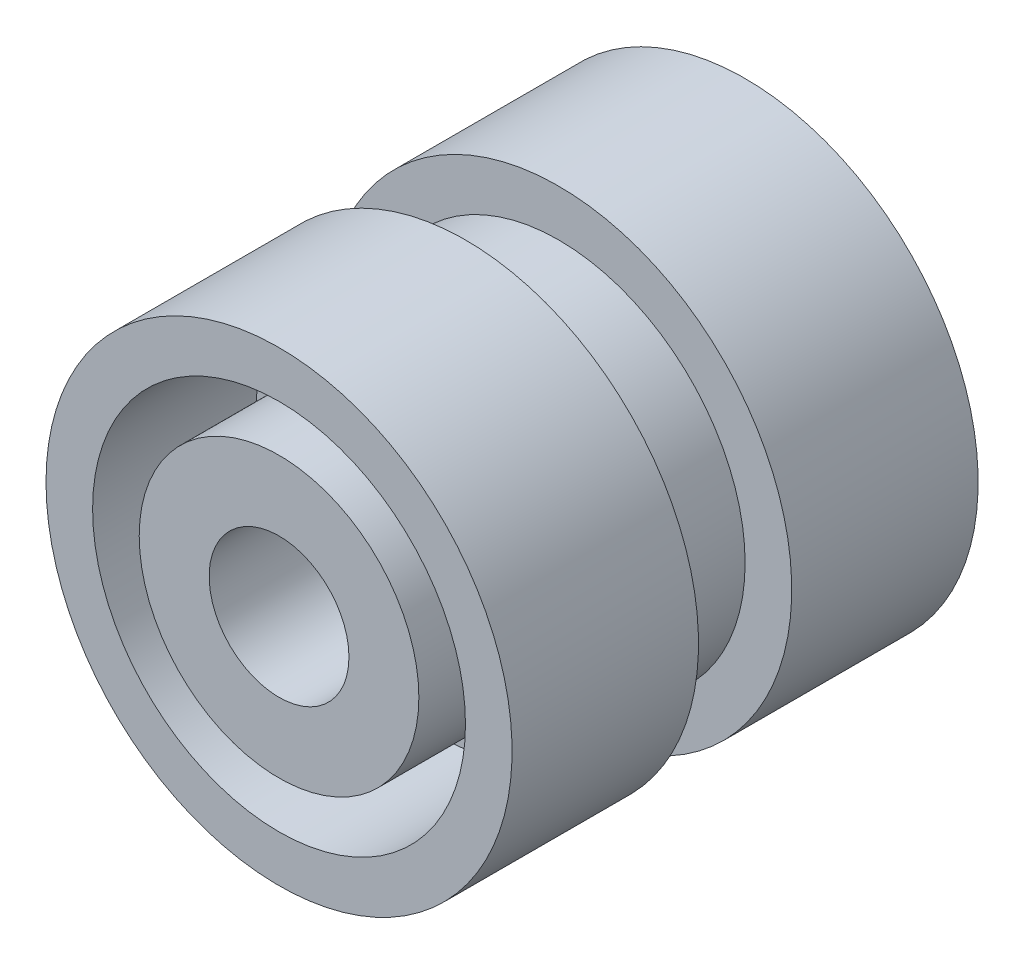
ISO-10303-21;
HEADER;
FILE_DESCRIPTION(('STEP AP214'),'2;1');
FILE_NAME('part.step','',(''),(''),'','','');
FILE_SCHEMA(('AUTOMOTIVE_DESIGN { 1 0 10303 214 1 1 1 1 }'));
ENDSEC;
DATA;
#1=APPLICATION_CONTEXT('core data for automotive mechanical design processes');
#2=APPLICATION_PROTOCOL_DEFINITION('international standard','automotive_design',2000,#1);
#3=PRODUCT_CONTEXT('',#1,'mechanical');
#4=PRODUCT('Part','Part','',(#3));
#5=PRODUCT_RELATED_PRODUCT_CATEGORY('part','',(#4));
#6=PRODUCT_DEFINITION_FORMATION('','',#4);
#7=PRODUCT_DEFINITION_CONTEXT('part definition',#1,'design');
#8=PRODUCT_DEFINITION('design','',#6,#7);
#9=PRODUCT_DEFINITION_SHAPE('','',#8);
#10=(LENGTH_UNIT() NAMED_UNIT(*) SI_UNIT(.MILLI.,.METRE.));
#11=(NAMED_UNIT(*) PLANE_ANGLE_UNIT() SI_UNIT($,.RADIAN.));
#12=(NAMED_UNIT(*) SI_UNIT($,.STERADIAN.) SOLID_ANGLE_UNIT());
#13=UNCERTAINTY_MEASURE_WITH_UNIT(LENGTH_MEASURE(1.E-05),#10,'distance_accuracy_value','');
#14=(GEOMETRIC_REPRESENTATION_CONTEXT(3) GLOBAL_UNCERTAINTY_ASSIGNED_CONTEXT((#13)) GLOBAL_UNIT_ASSIGNED_CONTEXT((#10,
#11,#12)) REPRESENTATION_CONTEXT('',''));
#15=CARTESIAN_POINT('',(0.,0.,0.));
#16=DIRECTION('',(0.,0.,1.));
#17=DIRECTION('',(1.,0.,0.));
#18=AXIS2_PLACEMENT_3D('',#15,#16,#17);
#19=CARTESIAN_POINT('',(0.,4.,-1.5));
#20=DIRECTION('',(0.,0.,-1.));
#21=DIRECTION('',(-1.,0.,0.));
#22=AXIS2_PLACEMENT_3D('',#19,#20,#21);
#23=PLANE('',#22);
#24=DIRECTION('',(0.,-1.,0.));
#25=VECTOR('',#24,1.);
#26=CARTESIAN_POINT('',(-0.5,0.,-1.5));
#27=LINE('',#26,#25);
#28=CARTESIAN_POINT('',(-0.5,-1.93649167310371,-1.5));
#29=VERTEX_POINT('',#28);
#30=CARTESIAN_POINT('',(-0.500000000000001,-3.96862696659689,-1.5));
#31=VERTEX_POINT('',#30);
#32=EDGE_CURVE('E159',#29,#31,#27,.T.);
#33=ORIENTED_EDGE('',*,*,#32,.T.);
#34=CARTESIAN_POINT('',(0.,0.,-1.5));
#35=DIRECTION('',(0.,0.,-1.));
#36=DIRECTION('',(-1.,0.,0.));
#37=AXIS2_PLACEMENT_3D('',#34,#35,#36);
#38=CIRCLE('',#37,4.);
#39=CARTESIAN_POINT('',(-3.96862696659689,-0.5,-1.5));
#40=VERTEX_POINT('',#39);
#41=EDGE_CURVE('E161',#31,#40,#38,.T.);
#42=ORIENTED_EDGE('',*,*,#41,.T.);
#43=DIRECTION('',(-1.,0.,0.));
#44=VECTOR('',#43,1.);
#45=CARTESIAN_POINT('',(0.,-0.5,-1.5));
#46=LINE('',#45,#44);
#47=CARTESIAN_POINT('',(-1.93649167310371,-0.5,-1.5));
#48=VERTEX_POINT('',#47);
#49=EDGE_CURVE('E61',#48,#40,#46,.T.);
#50=ORIENTED_EDGE('',*,*,#49,.F.);
#51=CARTESIAN_POINT('',(0.,0.,-1.5));
#52=DIRECTION('',(0.,0.,-1.));
#53=DIRECTION('',(-1.,0.,0.));
#54=AXIS2_PLACEMENT_3D('',#51,#52,#53);
#55=CIRCLE('',#54,2.);
#56=EDGE_CURVE('E56',#29,#48,#55,.T.);
#57=ORIENTED_EDGE('',*,*,#56,.F.);
#58=EDGE_LOOP('',(#33,#42,#50,#57));
#59=FACE_BOUND('',#58,.T.);
#60=ADVANCED_FACE('F41',(#59),#23,.T.);
#61=DIRECTION('',(-1.,0.,0.));
#62=VECTOR('',#61,1.);
#63=CARTESIAN_POINT('',(0.,0.5,-1.5));
#64=LINE('',#63,#62);
#65=CARTESIAN_POINT('',(-1.93649167310371,0.5,-1.5));
#66=VERTEX_POINT('',#65);
#67=CARTESIAN_POINT('',(-3.96862696659689,0.5,-1.5));
#68=VERTEX_POINT('',#67);
#69=EDGE_CURVE('E219',#66,#68,#64,.T.);
#70=ORIENTED_EDGE('',*,*,#69,.T.);
#71=CARTESIAN_POINT('',(-0.5,3.96862696659689,-1.5));
#72=VERTEX_POINT('',#71);
#73=EDGE_CURVE('E277',#68,#72,#38,.T.);
#74=ORIENTED_EDGE('',*,*,#73,.T.);
#75=DIRECTION('',(0.,1.,0.));
#76=VECTOR('',#75,1.);
#77=CARTESIAN_POINT('',(-0.5,0.,-1.5));
#78=LINE('',#77,#76);
#79=CARTESIAN_POINT('',(-0.5,1.93649167310371,-1.5));
#80=VERTEX_POINT('',#79);
#81=EDGE_CURVE('E224',#80,#72,#78,.T.);
#82=ORIENTED_EDGE('',*,*,#81,.F.);
#83=CARTESIAN_POINT('',(0.,0.,-1.5));
#84=DIRECTION('',(0.,0.,-1.));
#85=DIRECTION('',(-1.,0.,0.));
#86=AXIS2_PLACEMENT_3D('',#83,#84,#85);
#87=CIRCLE('',#86,2.);
#88=EDGE_CURVE('E221',#66,#80,#87,.T.);
#89=ORIENTED_EDGE('',*,*,#88,.F.);
#90=EDGE_LOOP('',(#70,#74,#82,#89));
#91=FACE_BOUND('',#90,.T.);
#92=ADVANCED_FACE('F326',(#91),#23,.T.);
#93=DIRECTION('',(0.,1.,0.));
#94=VECTOR('',#93,1.);
#95=CARTESIAN_POINT('',(0.5,0.,-1.5));
#96=LINE('',#95,#94);
#97=CARTESIAN_POINT('',(0.5,1.93649167310371,-1.5));
#98=VERTEX_POINT('',#97);
#99=CARTESIAN_POINT('',(0.5,3.96862696659689,-1.5));
#100=VERTEX_POINT('',#99);
#101=EDGE_CURVE('E227',#98,#100,#96,.T.);
#102=ORIENTED_EDGE('',*,*,#101,.T.);
#103=CARTESIAN_POINT('',(3.96862696659689,0.499999999999999,-1.5));
#104=VERTEX_POINT('',#103);
#105=EDGE_CURVE('E281',#100,#104,#38,.T.);
#106=ORIENTED_EDGE('',*,*,#105,.T.);
#107=DIRECTION('',(1.,0.,0.));
#108=VECTOR('',#107,1.);
#109=CARTESIAN_POINT('',(0.,0.5,-1.5));
#110=LINE('',#109,#108);
#111=CARTESIAN_POINT('',(1.93649167310371,0.5,-1.5));
#112=VERTEX_POINT('',#111);
#113=EDGE_CURVE('E232',#112,#104,#110,.T.);
#114=ORIENTED_EDGE('',*,*,#113,.F.);
#115=CARTESIAN_POINT('',(0.,0.,-1.5));
#116=DIRECTION('',(0.,0.,-1.));
#117=DIRECTION('',(-1.,0.,0.));
#118=AXIS2_PLACEMENT_3D('',#115,#116,#117);
#119=CIRCLE('',#118,2.);
#120=EDGE_CURVE('E229',#98,#112,#119,.T.);
#121=ORIENTED_EDGE('',*,*,#120,.F.);
#122=EDGE_LOOP('',(#102,#106,#114,#121));
#123=FACE_BOUND('',#122,.T.);
#124=ADVANCED_FACE('F330',(#123),#23,.T.);
#125=CARTESIAN_POINT('',(0.,0.,0.));
#126=DIRECTION('',(0.,0.,-1.));
#127=DIRECTION('',(-1.,0.,0.));
#128=AXIS2_PLACEMENT_3D('',#125,#126,#127);
#129=CYLINDRICAL_SURFACE('',#128,4.);
#130=CARTESIAN_POINT('',(0.,0.,-5.));
#131=DIRECTION('',(0.,0.,-1.));
#132=DIRECTION('',(-1.,0.,0.));
#133=AXIS2_PLACEMENT_3D('',#130,#131,#132);
#134=CIRCLE('',#133,4.);
#135=CARTESIAN_POINT('',(-4.,0.,-5.));
#136=VERTEX_POINT('',#135);
#137=EDGE_CURVE('E280',#136,#136,#134,.T.);
#138=ORIENTED_EDGE('',*,*,#137,.T.);
#139=EDGE_LOOP('',(#138));
#140=FACE_BOUND('',#139,.T.);
#141=CARTESIAN_POINT('',(0.,0.,-3.5));
#142=DIRECTION('',(0.,0.,-1.));
#143=DIRECTION('',(-1.,0.,0.));
#144=AXIS2_PLACEMENT_3D('',#141,#142,#143);
#145=CIRCLE('',#144,4.);
#146=CARTESIAN_POINT('',(-0.5,3.96862696659689,-3.5));
#147=VERTEX_POINT('',#146);
#148=CARTESIAN_POINT('',(0.5,3.96862696659689,-3.5));
#149=VERTEX_POINT('',#148);
#150=EDGE_CURVE('E191',#147,#149,#145,.T.);
#151=ORIENTED_EDGE('',*,*,#150,.F.);
#152=DIRECTION('',(0.,0.,1.));
#153=VECTOR('',#152,1.);
#154=CARTESIAN_POINT('',(-0.5,3.96862696659689,-3.5));
#155=LINE('',#154,#153);
#156=EDGE_CURVE('E263',#147,#72,#155,.T.);
#157=ORIENTED_EDGE('',*,*,#156,.T.);
#158=ORIENTED_EDGE('',*,*,#73,.F.);
#159=DIRECTION('',(0.,0.,1.));
#160=VECTOR('',#159,1.);
#161=CARTESIAN_POINT('',(-3.96862696659689,0.5,-3.5));
#162=LINE('',#161,#160);
#163=CARTESIAN_POINT('',(-3.96862696659689,0.5,-3.5));
#164=VERTEX_POINT('',#163);
#165=EDGE_CURVE('E271',#164,#68,#162,.T.);
#166=ORIENTED_EDGE('',*,*,#165,.F.);
#167=CARTESIAN_POINT('',(-3.96862696659689,-0.5,-3.5));
#168=VERTEX_POINT('',#167);
#169=EDGE_CURVE('E187',#168,#164,#145,.T.);
#170=ORIENTED_EDGE('',*,*,#169,.F.);
#171=DIRECTION('',(0.,0.,1.));
#172=VECTOR('',#171,1.);
#173=CARTESIAN_POINT('',(-3.96862696659689,-0.5,-3.5));
#174=LINE('',#173,#172);
#175=EDGE_CURVE('E274',#168,#40,#174,.T.);
#176=ORIENTED_EDGE('',*,*,#175,.T.);
#177=ORIENTED_EDGE('',*,*,#41,.F.);
#178=DIRECTION('',(0.,0.,1.));
#179=VECTOR('',#178,1.);
#180=CARTESIAN_POINT('',(-0.500000000000001,-3.96862696659689,-3.5));
#181=LINE('',#180,#179);
#182=CARTESIAN_POINT('',(-0.500000000000001,-3.96862696659689,-3.5));
#183=VERTEX_POINT('',#182);
#184=EDGE_CURVE('E239',#183,#31,#181,.T.);
#185=ORIENTED_EDGE('',*,*,#184,.F.);
#186=CARTESIAN_POINT('',(0.499999999999999,-3.96862696659689,-3.5));
#187=VERTEX_POINT('',#186);
#188=EDGE_CURVE('E176',#187,#183,#145,.T.);
#189=ORIENTED_EDGE('',*,*,#188,.F.);
#190=DIRECTION('',(0.,0.,1.));
#191=VECTOR('',#190,1.);
#192=CARTESIAN_POINT('',(0.499999999999999,-3.96862696659689,-3.5));
#193=LINE('',#192,#191);
#194=CARTESIAN_POINT('',(0.499999999999999,-3.96862696659689,-1.5));
#195=VERTEX_POINT('',#194);
#196=EDGE_CURVE('E241',#187,#195,#193,.T.);
#197=ORIENTED_EDGE('',*,*,#196,.T.);
#198=CARTESIAN_POINT('',(3.96862696659689,-0.500000000000001,-1.5));
#199=VERTEX_POINT('',#198);
#200=EDGE_CURVE('E351',#199,#195,#38,.T.);
#201=ORIENTED_EDGE('',*,*,#200,.F.);
#202=DIRECTION('',(0.,0.,1.));
#203=VECTOR('',#202,1.);
#204=CARTESIAN_POINT('',(3.96862696659689,-0.500000000000001,-3.5));
#205=LINE('',#204,#203);
#206=CARTESIAN_POINT('',(3.96862696659689,-0.500000000000001,-3.5));
#207=VERTEX_POINT('',#206);
#208=EDGE_CURVE('E249',#207,#199,#205,.T.);
#209=ORIENTED_EDGE('',*,*,#208,.F.);
#210=CARTESIAN_POINT('',(3.96862696659689,0.499999999999999,-3.5));
#211=VERTEX_POINT('',#210);
#212=EDGE_CURVE('E207',#211,#207,#145,.T.);
#213=ORIENTED_EDGE('',*,*,#212,.F.);
#214=DIRECTION('',(0.,0.,1.));
#215=VECTOR('',#214,1.);
#216=CARTESIAN_POINT('',(3.96862696659689,0.499999999999999,-3.5));
#217=LINE('',#216,#215);
#218=EDGE_CURVE('E252',#211,#104,#217,.T.);
#219=ORIENTED_EDGE('',*,*,#218,.T.);
#220=ORIENTED_EDGE('',*,*,#105,.F.);
#221=DIRECTION('',(0.,0.,1.));
#222=VECTOR('',#221,1.);
#223=CARTESIAN_POINT('',(0.5,3.96862696659689,-3.5));
#224=LINE('',#223,#222);
#225=EDGE_CURVE('E260',#149,#100,#224,.T.);
#226=ORIENTED_EDGE('',*,*,#225,.F.);
#227=EDGE_LOOP('',(#151,#157,#158,#166,#170,#176,#177,#185,#189,#197,#201,#209,#213,#219,#220,#226));
#228=FACE_BOUND('',#227,.T.);
#229=ADVANCED_FACE('F333',(#140,#228),#129,.F.);
#230=DIRECTION('',(1.,0.,0.));
#231=VECTOR('',#230,1.);
#232=CARTESIAN_POINT('',(0.,-0.5,-1.5));
#233=LINE('',#232,#231);
#234=CARTESIAN_POINT('',(1.93649167310371,-0.5,-1.5));
#235=VERTEX_POINT('',#234);
#236=EDGE_CURVE('E235',#235,#199,#233,.T.);
#237=ORIENTED_EDGE('',*,*,#236,.T.);
#238=ORIENTED_EDGE('',*,*,#200,.T.);
#239=DIRECTION('',(0.,-1.,0.));
#240=VECTOR('',#239,1.);
#241=CARTESIAN_POINT('',(0.5,0.,-1.5));
#242=LINE('',#241,#240);
#243=CARTESIAN_POINT('',(0.5,-1.93649167310371,-1.5));
#244=VERTEX_POINT('',#243);
#245=EDGE_CURVE('E177',#244,#195,#242,.T.);
#246=ORIENTED_EDGE('',*,*,#245,.F.);
#247=CARTESIAN_POINT('',(0.,0.,-1.5));
#248=DIRECTION('',(0.,0.,-1.));
#249=DIRECTION('',(-1.,0.,0.));
#250=AXIS2_PLACEMENT_3D('',#247,#248,#249);
#251=CIRCLE('',#250,2.);
#252=EDGE_CURVE('E180',#235,#244,#251,.T.);
#253=ORIENTED_EDGE('',*,*,#252,.F.);
#254=EDGE_LOOP('',(#237,#238,#246,#253));
#255=FACE_BOUND('',#254,.T.);
#256=ADVANCED_FACE('F43',(#255),#23,.T.);
#257=CARTESIAN_POINT('',(0.,0.,5.));
#258=DIRECTION('',(0.,0.,1.));
#259=DIRECTION('',(1.,0.,0.));
#260=AXIS2_PLACEMENT_3D('',#257,#258,#259);
#261=PLANE('',#260);
#262=CARTESIAN_POINT('',(0.,0.,5.));
#263=DIRECTION('',(0.,0.,1.));
#264=DIRECTION('',(1.,0.,0.));
#265=AXIS2_PLACEMENT_3D('',#262,#263,#264);
#266=CIRCLE('',#265,1.5);
#267=CARTESIAN_POINT('',(1.5,0.,5.));
#268=VERTEX_POINT('',#267);
#269=EDGE_CURVE('E183',#268,#268,#266,.T.);
#270=ORIENTED_EDGE('',*,*,#269,.F.);
#271=EDGE_LOOP('',(#270));
#272=FACE_BOUND('',#271,.T.);
#273=CARTESIAN_POINT('',(0.,0.,5.));
#274=DIRECTION('',(0.,0.,-1.));
#275=DIRECTION('',(-1.,0.,0.));
#276=AXIS2_PLACEMENT_3D('',#273,#274,#275);
#277=CIRCLE('',#276,3.);
#278=CARTESIAN_POINT('',(-3.,0.,5.));
#279=VERTEX_POINT('',#278);
#280=EDGE_CURVE('E11',#279,#279,#277,.T.);
#281=ORIENTED_EDGE('',*,*,#280,.F.);
#282=EDGE_LOOP('',(#281));
#283=FACE_BOUND('',#282,.T.);
#284=ADVANCED_FACE('F315',(#272,#283),#261,.T.);
#285=CARTESIAN_POINT('',(0.,0.,0.));
#286=DIRECTION('',(0.,0.,-1.));
#287=DIRECTION('',(-1.,0.,0.));
#288=AXIS2_PLACEMENT_3D('',#285,#286,#287);
#289=CYLINDRICAL_SURFACE('',#288,3.);
#290=ORIENTED_EDGE('',*,*,#280,.T.);
#291=EDGE_LOOP('',(#290));
#292=FACE_BOUND('',#291,.T.);
#293=CARTESIAN_POINT('',(0.,0.,1.5));
#294=DIRECTION('',(0.,0.,-1.));
#295=DIRECTION('',(-1.,0.,0.));
#296=AXIS2_PLACEMENT_3D('',#293,#294,#295);
#297=CIRCLE('',#296,3.);
#298=CARTESIAN_POINT('',(-3.,0.,1.5));
#299=VERTEX_POINT('',#298);
#300=EDGE_CURVE('E49',#299,#299,#297,.T.);
#301=ORIENTED_EDGE('',*,*,#300,.F.);
#302=EDGE_LOOP('',(#301));
#303=FACE_BOUND('',#302,.T.);
#304=ADVANCED_FACE('F313',(#292,#303),#289,.T.);
#305=CARTESIAN_POINT('',(0.,3.,1.5));
#306=DIRECTION('',(0.,0.,1.));
#307=DIRECTION('',(1.,0.,0.));
#308=AXIS2_PLACEMENT_3D('',#305,#306,#307);
#309=PLANE('',#308);
#310=ORIENTED_EDGE('',*,*,#300,.T.);
#311=EDGE_LOOP('',(#310));
#312=FACE_BOUND('',#311,.T.);
#313=CARTESIAN_POINT('',(0.,0.,1.5));
#314=DIRECTION('',(0.,0.,-1.));
#315=DIRECTION('',(-1.,0.,0.));
#316=AXIS2_PLACEMENT_3D('',#313,#314,#315);
#317=CIRCLE('',#316,4.);
#318=CARTESIAN_POINT('',(-4.,0.,1.5));
#319=VERTEX_POINT('',#318);
#320=EDGE_CURVE('E305',#319,#319,#317,.T.);
#321=ORIENTED_EDGE('',*,*,#320,.F.);
#322=EDGE_LOOP('',(#321));
#323=FACE_BOUND('',#322,.T.);
#324=ADVANCED_FACE('F310',(#312,#323),#309,.T.);
#325=CARTESIAN_POINT('',(0.,0.,0.));
#326=DIRECTION('',(0.,0.,-1.));
#327=DIRECTION('',(-1.,0.,0.));
#328=AXIS2_PLACEMENT_3D('',#325,#326,#327);
#329=CYLINDRICAL_SURFACE('',#328,4.);
#330=ORIENTED_EDGE('',*,*,#320,.T.);
#331=EDGE_LOOP('',(#330));
#332=FACE_BOUND('',#331,.T.);
#333=CARTESIAN_POINT('',(0.,0.,5.));
#334=DIRECTION('',(0.,0.,-1.));
#335=DIRECTION('',(-1.,0.,0.));
#336=AXIS2_PLACEMENT_3D('',#333,#334,#335);
#337=CIRCLE('',#336,4.);
#338=CARTESIAN_POINT('',(-4.,0.,5.));
#339=VERTEX_POINT('',#338);
#340=EDGE_CURVE('E302',#339,#339,#337,.T.);
#341=ORIENTED_EDGE('',*,*,#340,.F.);
#342=EDGE_LOOP('',(#341));
#343=FACE_BOUND('',#342,.T.);
#344=ADVANCED_FACE('F322',(#332,#343),#329,.F.);
#345=CARTESIAN_POINT('',(0.,4.,5.));
#346=DIRECTION('',(0.,0.,1.));
#347=DIRECTION('',(1.,0.,0.));
#348=AXIS2_PLACEMENT_3D('',#345,#346,#347);
#349=PLANE('',#348);
#350=ORIENTED_EDGE('',*,*,#340,.T.);
#351=EDGE_LOOP('',(#350));
#352=FACE_BOUND('',#351,.T.);
#353=CARTESIAN_POINT('',(0.,0.,5.));
#354=DIRECTION('',(0.,0.,-1.));
#355=DIRECTION('',(-1.,0.,0.));
#356=AXIS2_PLACEMENT_3D('',#353,#354,#355);
#357=CIRCLE('',#356,5.);
#358=CARTESIAN_POINT('',(-5.,0.,5.));
#359=VERTEX_POINT('',#358);
#360=EDGE_CURVE('E299',#359,#359,#357,.T.);
#361=ORIENTED_EDGE('',*,*,#360,.F.);
#362=EDGE_LOOP('',(#361));
#363=FACE_BOUND('',#362,.T.);
#364=ADVANCED_FACE('F431',(#352,#363),#349,.T.);
#365=CARTESIAN_POINT('',(0.,0.,0.));
#366=DIRECTION('',(0.,0.,-1.));
#367=DIRECTION('',(-1.,0.,0.));
#368=AXIS2_PLACEMENT_3D('',#365,#366,#367);
#369=CYLINDRICAL_SURFACE('',#368,5.);
#370=ORIENTED_EDGE('',*,*,#360,.T.);
#371=EDGE_LOOP('',(#370));
#372=FACE_BOUND('',#371,.T.);
#373=CARTESIAN_POINT('',(0.,0.,1.));
#374=DIRECTION('',(0.,0.,-1.));
#375=DIRECTION('',(-1.,0.,0.));
#376=AXIS2_PLACEMENT_3D('',#373,#374,#375);
#377=CIRCLE('',#376,5.);
#378=CARTESIAN_POINT('',(-5.,0.,1.));
#379=VERTEX_POINT('',#378);
#380=EDGE_CURVE('E296',#379,#379,#377,.T.);
#381=ORIENTED_EDGE('',*,*,#380,.F.);
#382=EDGE_LOOP('',(#381));
#383=FACE_BOUND('',#382,.T.);
#384=ADVANCED_FACE('F427',(#372,#383),#369,.T.);
#385=CARTESIAN_POINT('',(0.,5.,1.));
#386=DIRECTION('',(0.,0.,-1.));
#387=DIRECTION('',(-1.,0.,0.));
#388=AXIS2_PLACEMENT_3D('',#385,#386,#387);
#389=PLANE('',#388);
#390=ORIENTED_EDGE('',*,*,#380,.T.);
#391=EDGE_LOOP('',(#390));
#392=FACE_BOUND('',#391,.T.);
#393=CARTESIAN_POINT('',(0.,0.,1.));
#394=DIRECTION('',(0.,0.,-1.));
#395=DIRECTION('',(-1.,0.,0.));
#396=AXIS2_PLACEMENT_3D('',#393,#394,#395);
#397=CIRCLE('',#396,4.);
#398=CARTESIAN_POINT('',(-4.,0.,1.));
#399=VERTEX_POINT('',#398);
#400=EDGE_CURVE('E293',#399,#399,#397,.T.);
#401=ORIENTED_EDGE('',*,*,#400,.F.);
#402=EDGE_LOOP('',(#401));
#403=FACE_BOUND('',#402,.T.);
#404=ADVANCED_FACE('F423',(#392,#403),#389,.T.);
#405=CARTESIAN_POINT('',(0.,0.,0.));
#406=DIRECTION('',(0.,0.,-1.));
#407=DIRECTION('',(-1.,0.,0.));
#408=AXIS2_PLACEMENT_3D('',#405,#406,#407);
#409=CYLINDRICAL_SURFACE('',#408,4.);
#410=ORIENTED_EDGE('',*,*,#400,.T.);
#411=EDGE_LOOP('',(#410));
#412=FACE_BOUND('',#411,.T.);
#413=CARTESIAN_POINT('',(0.,0.,-0.999999999999999));
#414=DIRECTION('',(0.,0.,-1.));
#415=DIRECTION('',(-1.,0.,0.));
#416=AXIS2_PLACEMENT_3D('',#413,#414,#415);
#417=CIRCLE('',#416,4.);
#418=CARTESIAN_POINT('',(-4.,0.,-0.999999999999999));
#419=VERTEX_POINT('',#418);
#420=EDGE_CURVE('E290',#419,#419,#417,.T.);
#421=ORIENTED_EDGE('',*,*,#420,.F.);
#422=EDGE_LOOP('',(#421));
#423=FACE_BOUND('',#422,.T.);
#424=ADVANCED_FACE('F419',(#412,#423),#409,.T.);
#425=CARTESIAN_POINT('',(0.,5.,-1.));
#426=DIRECTION('',(0.,0.,1.));
#427=DIRECTION('',(1.,0.,0.));
#428=AXIS2_PLACEMENT_3D('',#425,#426,#427);
#429=PLANE('',#428);
#430=ORIENTED_EDGE('',*,*,#420,.T.);
#431=EDGE_LOOP('',(#430));
#432=FACE_BOUND('',#431,.T.);
#433=CARTESIAN_POINT('',(0.,0.,-1.));
#434=DIRECTION('',(0.,0.,-1.));
#435=DIRECTION('',(-1.,0.,0.));
#436=AXIS2_PLACEMENT_3D('',#433,#434,#435);
#437=CIRCLE('',#436,5.);
#438=CARTESIAN_POINT('',(-5.,0.,-1.));
#439=VERTEX_POINT('',#438);
#440=EDGE_CURVE('E287',#439,#439,#437,.T.);
#441=ORIENTED_EDGE('',*,*,#440,.F.);
#442=EDGE_LOOP('',(#441));
#443=FACE_BOUND('',#442,.T.);
#444=ADVANCED_FACE('F415',(#432,#443),#429,.T.);
#445=CARTESIAN_POINT('',(0.,0.,0.));
#446=DIRECTION('',(0.,0.,-1.));
#447=DIRECTION('',(-1.,0.,0.));
#448=AXIS2_PLACEMENT_3D('',#445,#446,#447);
#449=CYLINDRICAL_SURFACE('',#448,5.);
#450=ORIENTED_EDGE('',*,*,#440,.T.);
#451=EDGE_LOOP('',(#450));
#452=FACE_BOUND('',#451,.T.);
#453=CARTESIAN_POINT('',(0.,0.,-5.));
#454=DIRECTION('',(0.,0.,-1.));
#455=DIRECTION('',(-1.,0.,0.));
#456=AXIS2_PLACEMENT_3D('',#453,#454,#455);
#457=CIRCLE('',#456,5.);
#458=CARTESIAN_POINT('',(-5.,0.,-5.));
#459=VERTEX_POINT('',#458);
#460=EDGE_CURVE('E284',#459,#459,#457,.T.);
#461=ORIENTED_EDGE('',*,*,#460,.F.);
#462=EDGE_LOOP('',(#461));
#463=FACE_BOUND('',#462,.T.);
#464=ADVANCED_FACE('F411',(#452,#463),#449,.T.);
#465=CARTESIAN_POINT('',(0.,4.,-5.));
#466=DIRECTION('',(0.,0.,-1.));
#467=DIRECTION('',(-1.,0.,0.));
#468=AXIS2_PLACEMENT_3D('',#465,#466,#467);
#469=PLANE('',#468);
#470=ORIENTED_EDGE('',*,*,#460,.T.);
#471=EDGE_LOOP('',(#470));
#472=FACE_BOUND('',#471,.T.);
#473=ORIENTED_EDGE('',*,*,#137,.F.);
#474=EDGE_LOOP('',(#473));
#475=FACE_BOUND('',#474,.T.);
#476=ADVANCED_FACE('F407',(#472,#475),#469,.T.);
#477=CARTESIAN_POINT('',(-0.5,0.,-3.5));
#478=DIRECTION('',(-1.,0.,0.));
#479=DIRECTION('',(0.,-1.,0.));
#480=AXIS2_PLACEMENT_3D('',#477,#478,#479);
#481=PLANE('',#480);
#482=ORIENTED_EDGE('',*,*,#32,.F.);
#483=DIRECTION('',(0.,0.,1.));
#484=VECTOR('',#483,1.);
#485=CARTESIAN_POINT('',(-0.5,-1.93649167310371,-3.5));
#486=LINE('',#485,#484);
#487=CARTESIAN_POINT('',(-0.5,-1.93649167310371,-3.5));
#488=VERTEX_POINT('',#487);
#489=EDGE_CURVE('E153',#488,#29,#486,.T.);
#490=ORIENTED_EDGE('',*,*,#489,.F.);
#491=DIRECTION('',(0.,-1.,0.));
#492=VECTOR('',#491,1.);
#493=CARTESIAN_POINT('',(-0.5,0.,-3.5));
#494=LINE('',#493,#492);
#495=EDGE_CURVE('E158',#488,#183,#494,.T.);
#496=ORIENTED_EDGE('',*,*,#495,.T.);
#497=ORIENTED_EDGE('',*,*,#184,.T.);
#498=EDGE_LOOP('',(#482,#490,#496,#497));
#499=FACE_BOUND('',#498,.T.);
#500=ADVANCED_FACE('F155',(#499),#481,.T.);
#501=CARTESIAN_POINT('',(0.,0.,-3.5));
#502=DIRECTION('',(0.,0.,1.));
#503=DIRECTION('',(1.,0.,0.));
#504=AXIS2_PLACEMENT_3D('',#501,#502,#503);
#505=CYLINDRICAL_SURFACE('',#504,2.);
#506=ORIENTED_EDGE('',*,*,#56,.T.);
#507=DIRECTION('',(0.,0.,1.));
#508=VECTOR('',#507,1.);
#509=CARTESIAN_POINT('',(-1.93649167310371,-0.5,-3.5));
#510=LINE('',#509,#508);
#511=CARTESIAN_POINT('',(-1.93649167310371,-0.5,-3.5));
#512=VERTEX_POINT('',#511);
#513=EDGE_CURVE('E162',#512,#48,#510,.T.);
#514=ORIENTED_EDGE('',*,*,#513,.F.);
#515=CARTESIAN_POINT('',(0.,0.,-3.5));
#516=DIRECTION('',(0.,0.,-1.));
#517=DIRECTION('',(-1.,0.,0.));
#518=AXIS2_PLACEMENT_3D('',#515,#516,#517);
#519=CIRCLE('',#518,2.);
#520=EDGE_CURVE('E165',#488,#512,#519,.T.);
#521=ORIENTED_EDGE('',*,*,#520,.F.);
#522=ORIENTED_EDGE('',*,*,#489,.T.);
#523=EDGE_LOOP('',(#506,#514,#521,#522));
#524=FACE_BOUND('',#523,.T.);
#525=ADVANCED_FACE('F166',(#524),#505,.T.);
#526=CARTESIAN_POINT('',(0.,-0.5,-3.5));
#527=DIRECTION('',(0.,1.,0.));
#528=DIRECTION('',(-1.,0.,0.));
#529=AXIS2_PLACEMENT_3D('',#526,#527,#528);
#530=PLANE('',#529);
#531=ORIENTED_EDGE('',*,*,#49,.T.);
#532=ORIENTED_EDGE('',*,*,#175,.F.);
#533=DIRECTION('',(-1.,0.,0.));
#534=VECTOR('',#533,1.);
#535=CARTESIAN_POINT('',(0.,-0.5,-3.5));
#536=LINE('',#535,#534);
#537=EDGE_CURVE('E171',#512,#168,#536,.T.);
#538=ORIENTED_EDGE('',*,*,#537,.F.);
#539=ORIENTED_EDGE('',*,*,#513,.T.);
#540=EDGE_LOOP('',(#531,#532,#538,#539));
#541=FACE_BOUND('',#540,.T.);
#542=ADVANCED_FACE('F377',(#541),#530,.F.);
#543=CARTESIAN_POINT('',(0.,0.5,-3.5));
#544=DIRECTION('',(0.,1.,0.));
#545=DIRECTION('',(-1.,0.,0.));
#546=AXIS2_PLACEMENT_3D('',#543,#544,#545);
#547=PLANE('',#546);
#548=ORIENTED_EDGE('',*,*,#69,.F.);
#549=DIRECTION('',(0.,0.,1.));
#550=VECTOR('',#549,1.);
#551=CARTESIAN_POINT('',(-1.93649167310371,0.5,-3.5));
#552=LINE('',#551,#550);
#553=CARTESIAN_POINT('',(-1.93649167310371,0.5,-3.5));
#554=VERTEX_POINT('',#553);
#555=EDGE_CURVE('E268',#554,#66,#552,.T.);
#556=ORIENTED_EDGE('',*,*,#555,.F.);
#557=DIRECTION('',(-1.,0.,0.));
#558=VECTOR('',#557,1.);
#559=CARTESIAN_POINT('',(0.,0.5,-3.5));
#560=LINE('',#559,#558);
#561=EDGE_CURVE('E190',#554,#164,#560,.T.);
#562=ORIENTED_EDGE('',*,*,#561,.T.);
#563=ORIENTED_EDGE('',*,*,#165,.T.);
#564=EDGE_LOOP('',(#548,#556,#562,#563));
#565=FACE_BOUND('',#564,.T.);
#566=ADVANCED_FACE('F381',(#565),#547,.T.);
#567=CARTESIAN_POINT('',(0.,0.,-3.5));
#568=DIRECTION('',(0.,0.,1.));
#569=DIRECTION('',(1.,0.,0.));
#570=AXIS2_PLACEMENT_3D('',#567,#568,#569);
#571=CYLINDRICAL_SURFACE('',#570,2.);
#572=ORIENTED_EDGE('',*,*,#88,.T.);
#573=DIRECTION('',(0.,0.,1.));
#574=VECTOR('',#573,1.);
#575=CARTESIAN_POINT('',(-0.5,1.93649167310371,-3.5));
#576=LINE('',#575,#574);
#577=CARTESIAN_POINT('',(-0.5,1.93649167310371,-3.5));
#578=VERTEX_POINT('',#577);
#579=EDGE_CURVE('E265',#578,#80,#576,.T.);
#580=ORIENTED_EDGE('',*,*,#579,.F.);
#581=CARTESIAN_POINT('',(0.,0.,-3.5));
#582=DIRECTION('',(0.,0.,-1.));
#583=DIRECTION('',(-1.,0.,0.));
#584=AXIS2_PLACEMENT_3D('',#581,#582,#583);
#585=CIRCLE('',#584,2.);
#586=EDGE_CURVE('E194',#554,#578,#585,.T.);
#587=ORIENTED_EDGE('',*,*,#586,.F.);
#588=ORIENTED_EDGE('',*,*,#555,.T.);
#589=EDGE_LOOP('',(#572,#580,#587,#588));
#590=FACE_BOUND('',#589,.T.);
#591=ADVANCED_FACE('F385',(#590),#571,.T.);
#592=CARTESIAN_POINT('',(-0.5,0.,-3.5));
#593=DIRECTION('',(1.,0.,0.));
#594=DIRECTION('',(0.,0.,-1.));
#595=AXIS2_PLACEMENT_3D('',#592,#593,#594);
#596=PLANE('',#595);
#597=ORIENTED_EDGE('',*,*,#81,.T.);
#598=ORIENTED_EDGE('',*,*,#156,.F.);
#599=DIRECTION('',(0.,1.,0.));
#600=VECTOR('',#599,1.);
#601=CARTESIAN_POINT('',(-0.5,0.,-3.5));
#602=LINE('',#601,#600);
#603=EDGE_CURVE('E196',#578,#147,#602,.T.);
#604=ORIENTED_EDGE('',*,*,#603,.F.);
#605=ORIENTED_EDGE('',*,*,#579,.T.);
#606=EDGE_LOOP('',(#597,#598,#604,#605));
#607=FACE_BOUND('',#606,.T.);
#608=ADVANCED_FACE('F387',(#607),#596,.F.);
#609=CARTESIAN_POINT('',(0.5,0.,-3.5));
#610=DIRECTION('',(1.,0.,0.));
#611=DIRECTION('',(0.,0.,-1.));
#612=AXIS2_PLACEMENT_3D('',#609,#610,#611);
#613=PLANE('',#612);
#614=ORIENTED_EDGE('',*,*,#101,.F.);
#615=DIRECTION('',(0.,0.,1.));
#616=VECTOR('',#615,1.);
#617=CARTESIAN_POINT('',(0.5,1.93649167310371,-3.5));
#618=LINE('',#617,#616);
#619=CARTESIAN_POINT('',(0.5,1.93649167310371,-3.5));
#620=VERTEX_POINT('',#619);
#621=EDGE_CURVE('E257',#620,#98,#618,.T.);
#622=ORIENTED_EDGE('',*,*,#621,.F.);
#623=DIRECTION('',(0.,1.,0.));
#624=VECTOR('',#623,1.);
#625=CARTESIAN_POINT('',(0.5,0.,-3.5));
#626=LINE('',#625,#624);
#627=EDGE_CURVE('E199',#620,#149,#626,.T.);
#628=ORIENTED_EDGE('',*,*,#627,.T.);
#629=ORIENTED_EDGE('',*,*,#225,.T.);
#630=EDGE_LOOP('',(#614,#622,#628,#629));
#631=FACE_BOUND('',#630,.T.);
#632=ADVANCED_FACE('F352',(#631),#613,.T.);
#633=CARTESIAN_POINT('',(0.,0.,-3.5));
#634=DIRECTION('',(0.,0.,1.));
#635=DIRECTION('',(1.,0.,0.));
#636=AXIS2_PLACEMENT_3D('',#633,#634,#635);
#637=CYLINDRICAL_SURFACE('',#636,2.);
#638=ORIENTED_EDGE('',*,*,#120,.T.);
#639=DIRECTION('',(0.,0.,1.));
#640=VECTOR('',#639,1.);
#641=CARTESIAN_POINT('',(1.93649167310371,0.5,-3.5));
#642=LINE('',#641,#640);
#643=CARTESIAN_POINT('',(1.93649167310371,0.5,-3.5));
#644=VERTEX_POINT('',#643);
#645=EDGE_CURVE('E254',#644,#112,#642,.T.);
#646=ORIENTED_EDGE('',*,*,#645,.F.);
#647=CARTESIAN_POINT('',(0.,0.,-3.5));
#648=DIRECTION('',(0.,0.,-1.));
#649=DIRECTION('',(-1.,0.,0.));
#650=AXIS2_PLACEMENT_3D('',#647,#648,#649);
#651=CIRCLE('',#650,2.);
#652=EDGE_CURVE('E202',#620,#644,#651,.T.);
#653=ORIENTED_EDGE('',*,*,#652,.F.);
#654=ORIENTED_EDGE('',*,*,#621,.T.);
#655=EDGE_LOOP('',(#638,#646,#653,#654));
#656=FACE_BOUND('',#655,.T.);
#657=ADVANCED_FACE('F395',(#656),#637,.T.);
#658=CARTESIAN_POINT('',(0.,0.5,-3.5));
#659=DIRECTION('',(0.,-1.,0.));
#660=DIRECTION('',(1.,0.,0.));
#661=AXIS2_PLACEMENT_3D('',#658,#659,#660);
#662=PLANE('',#661);
#663=ORIENTED_EDGE('',*,*,#113,.T.);
#664=ORIENTED_EDGE('',*,*,#218,.F.);
#665=DIRECTION('',(1.,0.,0.));
#666=VECTOR('',#665,1.);
#667=CARTESIAN_POINT('',(0.,0.5,-3.5));
#668=LINE('',#667,#666);
#669=EDGE_CURVE('E204',#644,#211,#668,.T.);
#670=ORIENTED_EDGE('',*,*,#669,.F.);
#671=ORIENTED_EDGE('',*,*,#645,.T.);
#672=EDGE_LOOP('',(#663,#664,#670,#671));
#673=FACE_BOUND('',#672,.T.);
#674=ADVANCED_FACE('F529',(#673),#662,.F.);
#675=CARTESIAN_POINT('',(0.,-0.5,-3.5));
#676=DIRECTION('',(0.,-1.,0.));
#677=DIRECTION('',(1.,0.,0.));
#678=AXIS2_PLACEMENT_3D('',#675,#676,#677);
#679=PLANE('',#678);
#680=ORIENTED_EDGE('',*,*,#236,.F.);
#681=DIRECTION('',(0.,0.,1.));
#682=VECTOR('',#681,1.);
#683=CARTESIAN_POINT('',(1.93649167310371,-0.5,-3.5));
#684=LINE('',#683,#682);
#685=CARTESIAN_POINT('',(1.93649167310371,-0.5,-3.5));
#686=VERTEX_POINT('',#685);
#687=EDGE_CURVE('E246',#686,#235,#684,.T.);
#688=ORIENTED_EDGE('',*,*,#687,.F.);
#689=DIRECTION('',(1.,0.,0.));
#690=VECTOR('',#689,1.);
#691=CARTESIAN_POINT('',(0.,-0.5,-3.5));
#692=LINE('',#691,#690);
#693=EDGE_CURVE('E208',#686,#207,#692,.T.);
#694=ORIENTED_EDGE('',*,*,#693,.T.);
#695=ORIENTED_EDGE('',*,*,#208,.T.);
#696=EDGE_LOOP('',(#680,#688,#694,#695));
#697=FACE_BOUND('',#696,.T.);
#698=ADVANCED_FACE('F363',(#697),#679,.T.);
#699=CARTESIAN_POINT('',(0.,0.,-3.5));
#700=DIRECTION('',(0.,0.,1.));
#701=DIRECTION('',(1.,0.,0.));
#702=AXIS2_PLACEMENT_3D('',#699,#700,#701);
#703=CYLINDRICAL_SURFACE('',#702,2.);
#704=ORIENTED_EDGE('',*,*,#252,.T.);
#705=DIRECTION('',(0.,0.,1.));
#706=VECTOR('',#705,1.);
#707=CARTESIAN_POINT('',(0.5,-1.93649167310371,-3.5));
#708=LINE('',#707,#706);
#709=CARTESIAN_POINT('',(0.5,-1.93649167310371,-3.5));
#710=VERTEX_POINT('',#709);
#711=EDGE_CURVE('E243',#710,#244,#708,.T.);
#712=ORIENTED_EDGE('',*,*,#711,.F.);
#713=CARTESIAN_POINT('',(0.,0.,-3.5));
#714=DIRECTION('',(0.,0.,-1.));
#715=DIRECTION('',(-1.,0.,0.));
#716=AXIS2_PLACEMENT_3D('',#713,#714,#715);
#717=CIRCLE('',#716,2.);
#718=EDGE_CURVE('E211',#686,#710,#717,.T.);
#719=ORIENTED_EDGE('',*,*,#718,.F.);
#720=ORIENTED_EDGE('',*,*,#687,.T.);
#721=EDGE_LOOP('',(#704,#712,#719,#720));
#722=FACE_BOUND('',#721,.T.);
#723=ADVANCED_FACE('F367',(#722),#703,.T.);
#724=CARTESIAN_POINT('',(0.5,0.,-3.5));
#725=DIRECTION('',(-1.,0.,0.));
#726=DIRECTION('',(0.,-1.,0.));
#727=AXIS2_PLACEMENT_3D('',#724,#725,#726);
#728=PLANE('',#727);
#729=ORIENTED_EDGE('',*,*,#245,.T.);
#730=ORIENTED_EDGE('',*,*,#196,.F.);
#731=DIRECTION('',(0.,-1.,0.));
#732=VECTOR('',#731,1.);
#733=CARTESIAN_POINT('',(0.5,0.,-3.5));
#734=LINE('',#733,#732);
#735=EDGE_CURVE('E213',#710,#187,#734,.T.);
#736=ORIENTED_EDGE('',*,*,#735,.F.);
#737=ORIENTED_EDGE('',*,*,#711,.T.);
#738=EDGE_LOOP('',(#729,#730,#736,#737));
#739=FACE_BOUND('',#738,.T.);
#740=ADVANCED_FACE('F371',(#739),#728,.F.);
#741=CARTESIAN_POINT('',(0.,0.,-3.5));
#742=DIRECTION('',(0.,0.,-1.));
#743=DIRECTION('',(-1.,0.,0.));
#744=AXIS2_PLACEMENT_3D('',#741,#742,#743);
#745=PLANE('',#744);
#746=ORIENTED_EDGE('',*,*,#495,.F.);
#747=ORIENTED_EDGE('',*,*,#520,.T.);
#748=ORIENTED_EDGE('',*,*,#537,.T.);
#749=ORIENTED_EDGE('',*,*,#169,.T.);
#750=ORIENTED_EDGE('',*,*,#561,.F.);
#751=ORIENTED_EDGE('',*,*,#586,.T.);
#752=ORIENTED_EDGE('',*,*,#603,.T.);
#753=ORIENTED_EDGE('',*,*,#150,.T.);
#754=ORIENTED_EDGE('',*,*,#627,.F.);
#755=ORIENTED_EDGE('',*,*,#652,.T.);
#756=ORIENTED_EDGE('',*,*,#669,.T.);
#757=ORIENTED_EDGE('',*,*,#212,.T.);
#758=ORIENTED_EDGE('',*,*,#693,.F.);
#759=ORIENTED_EDGE('',*,*,#718,.T.);
#760=ORIENTED_EDGE('',*,*,#735,.T.);
#761=ORIENTED_EDGE('',*,*,#188,.T.);
#762=EDGE_LOOP('',(#746,#747,#748,#749,#750,#751,#752,#753,#754,#755,#756,#757,#758,#759,#760,#761));
#763=FACE_BOUND('',#762,.T.);
#764=ADVANCED_FACE('F174',(#763),#745,.T.);
#765=CARTESIAN_POINT('',(0.,0.,-3.));
#766=DIRECTION('',(0.,0.,1.));
#767=DIRECTION('',(1.,0.,0.));
#768=AXIS2_PLACEMENT_3D('',#765,#766,#767);
#769=CYLINDRICAL_SURFACE('',#768,1.5);
#770=CARTESIAN_POINT('',(0.,0.,-3.));
#771=DIRECTION('',(0.,0.,1.));
#772=DIRECTION('',(1.,0.,0.));
#773=AXIS2_PLACEMENT_3D('',#770,#771,#772);
#774=CIRCLE('',#773,1.5);
#775=CARTESIAN_POINT('',(1.5,0.,-3.));
#776=VERTEX_POINT('',#775);
#777=EDGE_CURVE('E216',#776,#776,#774,.T.);
#778=ORIENTED_EDGE('',*,*,#777,.F.);
#779=EDGE_LOOP('',(#778));
#780=FACE_BOUND('',#779,.T.);
#781=ORIENTED_EDGE('',*,*,#269,.T.);
#782=EDGE_LOOP('',(#781));
#783=FACE_BOUND('',#782,.T.);
#784=ADVANCED_FACE('F576',(#780,#783),#769,.F.);
#785=CARTESIAN_POINT('',(0.,0.,-3.));
#786=DIRECTION('',(0.,0.,1.));
#787=DIRECTION('',(1.,0.,0.));
#788=AXIS2_PLACEMENT_3D('',#785,#786,#787);
#789=PLANE('',#788);
#790=ORIENTED_EDGE('',*,*,#777,.T.);
#791=EDGE_LOOP('',(#790));
#792=FACE_BOUND('',#791,.T.);
#793=ADVANCED_FACE('F595',(#792),#789,.T.);
#794=CLOSED_SHELL('',(#60,#92,#124,#229,#256,#284,#304,#324,#344,#364,#384,#404,#424,#444,#464,
#476,#500,#525,#542,#566,#591,#608,#632,#657,#674,#698,#723,#740,#764,#784,#793));
#795=MANIFOLD_SOLID_BREP('B2',#794);
#796=ADVANCED_BREP_SHAPE_REPRESENTATION('',(#18,#795),#14);
#797=SHAPE_DEFINITION_REPRESENTATION(#9,#796);
ENDSEC;
END-ISO-10303-21;
